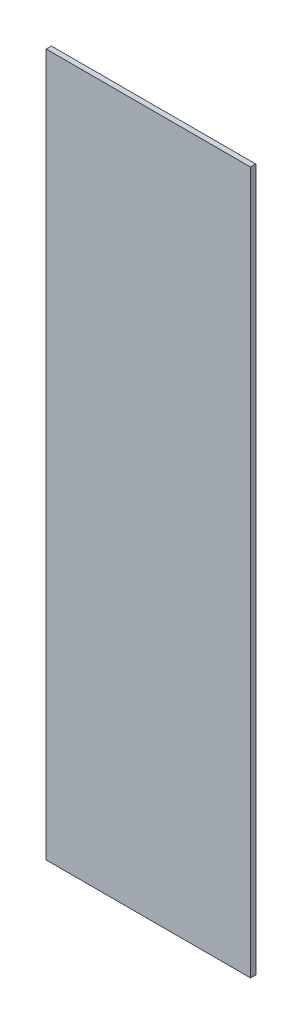
ISO-10303-21;
HEADER;
FILE_DESCRIPTION(('STEP AP214'),'2;1');
FILE_NAME('part.step','',(''),(''),'','','');
FILE_SCHEMA(('AUTOMOTIVE_DESIGN { 1 0 10303 214 1 1 1 1 }'));
ENDSEC;
DATA;
#1=APPLICATION_CONTEXT('core data for automotive mechanical design processes');
#2=APPLICATION_PROTOCOL_DEFINITION('international standard','automotive_design',2000,#1);
#3=PRODUCT_CONTEXT('',#1,'mechanical');
#4=PRODUCT('Part','Part','',(#3));
#5=PRODUCT_RELATED_PRODUCT_CATEGORY('part','',(#4));
#6=PRODUCT_DEFINITION_FORMATION('','',#4);
#7=PRODUCT_DEFINITION_CONTEXT('part definition',#1,'design');
#8=PRODUCT_DEFINITION('design','',#6,#7);
#9=PRODUCT_DEFINITION_SHAPE('','',#8);
#10=(LENGTH_UNIT() NAMED_UNIT(*) SI_UNIT(.MILLI.,.METRE.));
#11=(NAMED_UNIT(*) PLANE_ANGLE_UNIT() SI_UNIT($,.RADIAN.));
#12=(NAMED_UNIT(*) SI_UNIT($,.STERADIAN.) SOLID_ANGLE_UNIT());
#13=UNCERTAINTY_MEASURE_WITH_UNIT(LENGTH_MEASURE(1.E-05),#10,'distance_accuracy_value','');
#14=(GEOMETRIC_REPRESENTATION_CONTEXT(3) GLOBAL_UNCERTAINTY_ASSIGNED_CONTEXT((#13)) GLOBAL_UNIT_ASSIGNED_CONTEXT((#10,
#11,#12)) REPRESENTATION_CONTEXT('',''));
#15=CARTESIAN_POINT('',(0.,0.,0.));
#16=DIRECTION('',(0.,0.,1.));
#17=DIRECTION('',(1.,0.,0.));
#18=AXIS2_PLACEMENT_3D('',#15,#16,#17);
#19=CARTESIAN_POINT('',(97.4999999999999,335.,5.));
#20=DIRECTION('',(-1.,0.,0.));
#21=DIRECTION('',(0.,-1.,0.));
#22=AXIS2_PLACEMENT_3D('',#19,#20,#21);
#23=PLANE('',#22);
#24=DIRECTION('',(0.,1.,0.));
#25=VECTOR('',#24,1.);
#26=CARTESIAN_POINT('',(97.4999999999999,335.,0.));
#27=LINE('',#26,#25);
#28=CARTESIAN_POINT('',(97.5,-335.,0.));
#29=VERTEX_POINT('',#28);
#30=CARTESIAN_POINT('',(97.4999999999999,335.,0.));
#31=VERTEX_POINT('',#30);
#32=EDGE_CURVE('E99',#29,#31,#27,.T.);
#33=ORIENTED_EDGE('',*,*,#32,.T.);
#34=DIRECTION('',(0.,0.,-1.));
#35=VECTOR('',#34,1.);
#36=CARTESIAN_POINT('',(97.4999999999999,335.,5.));
#37=LINE('',#36,#35);
#38=CARTESIAN_POINT('',(97.4999999999999,335.,5.));
#39=VERTEX_POINT('',#38);
#40=EDGE_CURVE('E11',#39,#31,#37,.T.);
#41=ORIENTED_EDGE('',*,*,#40,.F.);
#42=DIRECTION('',(0.,1.,0.));
#43=VECTOR('',#42,1.);
#44=CARTESIAN_POINT('',(97.4999999999999,335.,5.));
#45=LINE('',#44,#43);
#46=CARTESIAN_POINT('',(97.5,-335.,5.));
#47=VERTEX_POINT('',#46);
#48=EDGE_CURVE('E87',#47,#39,#45,.T.);
#49=ORIENTED_EDGE('',*,*,#48,.F.);
#50=DIRECTION('',(0.,0.,-1.));
#51=VECTOR('',#50,1.);
#52=CARTESIAN_POINT('',(97.5,-335.,5.));
#53=LINE('',#52,#51);
#54=EDGE_CURVE('E95',#47,#29,#53,.T.);
#55=ORIENTED_EDGE('',*,*,#54,.T.);
#56=EDGE_LOOP('',(#33,#41,#49,#55));
#57=FACE_BOUND('',#56,.T.);
#58=ADVANCED_FACE('F36',(#57),#23,.F.);
#59=CARTESIAN_POINT('',(-97.5000000000001,335.,5.));
#60=DIRECTION('',(0.,-1.,0.));
#61=DIRECTION('',(0.,0.,-1.));
#62=AXIS2_PLACEMENT_3D('',#59,#60,#61);
#63=PLANE('',#62);
#64=DIRECTION('',(-1.,0.,0.));
#65=VECTOR('',#64,1.);
#66=CARTESIAN_POINT('',(-97.5000000000001,335.,0.));
#67=LINE('',#66,#65);
#68=CARTESIAN_POINT('',(-97.5000000000001,335.,0.));
#69=VERTEX_POINT('',#68);
#70=EDGE_CURVE('E91',#31,#69,#67,.T.);
#71=ORIENTED_EDGE('',*,*,#70,.T.);
#72=DIRECTION('',(0.,0.,-1.));
#73=VECTOR('',#72,1.);
#74=CARTESIAN_POINT('',(-97.5000000000001,335.,5.));
#75=LINE('',#74,#73);
#76=CARTESIAN_POINT('',(-97.5000000000001,335.,5.));
#77=VERTEX_POINT('',#76);
#78=EDGE_CURVE('E44',#77,#69,#75,.T.);
#79=ORIENTED_EDGE('',*,*,#78,.F.);
#80=DIRECTION('',(-1.,0.,0.));
#81=VECTOR('',#80,1.);
#82=CARTESIAN_POINT('',(-97.5000000000001,335.,5.));
#83=LINE('',#82,#81);
#84=EDGE_CURVE('E82',#39,#77,#83,.T.);
#85=ORIENTED_EDGE('',*,*,#84,.F.);
#86=ORIENTED_EDGE('',*,*,#40,.T.);
#87=EDGE_LOOP('',(#71,#79,#85,#86));
#88=FACE_BOUND('',#87,.T.);
#89=ADVANCED_FACE('F90',(#88),#63,.F.);
#90=CARTESIAN_POINT('',(-97.5000000000001,335.,5.));
#91=DIRECTION('',(1.,0.,0.));
#92=DIRECTION('',(0.,1.,0.));
#93=AXIS2_PLACEMENT_3D('',#90,#91,#92);
#94=PLANE('',#93);
#95=DIRECTION('',(0.,-1.,0.));
#96=VECTOR('',#95,1.);
#97=CARTESIAN_POINT('',(-97.5000000000001,335.,0.));
#98=LINE('',#97,#96);
#99=CARTESIAN_POINT('',(-97.5,-335.,0.));
#100=VERTEX_POINT('',#99);
#101=EDGE_CURVE('E69',#69,#100,#98,.T.);
#102=ORIENTED_EDGE('',*,*,#101,.T.);
#103=DIRECTION('',(0.,0.,-1.));
#104=VECTOR('',#103,1.);
#105=CARTESIAN_POINT('',(-97.5,-335.,5.));
#106=LINE('',#105,#104);
#107=CARTESIAN_POINT('',(-97.5,-335.,5.));
#108=VERTEX_POINT('',#107);
#109=EDGE_CURVE('E92',#108,#100,#106,.T.);
#110=ORIENTED_EDGE('',*,*,#109,.F.);
#111=DIRECTION('',(0.,-1.,0.));
#112=VECTOR('',#111,1.);
#113=CARTESIAN_POINT('',(-97.5000000000001,335.,5.));
#114=LINE('',#113,#112);
#115=EDGE_CURVE('E85',#77,#108,#114,.T.);
#116=ORIENTED_EDGE('',*,*,#115,.F.);
#117=ORIENTED_EDGE('',*,*,#78,.T.);
#118=EDGE_LOOP('',(#102,#110,#116,#117));
#119=FACE_BOUND('',#118,.T.);
#120=ADVANCED_FACE('F93',(#119),#94,.F.);
#121=CARTESIAN_POINT('',(-97.5,-335.,5.));
#122=DIRECTION('',(0.,1.,0.));
#123=DIRECTION('',(0.,0.,1.));
#124=AXIS2_PLACEMENT_3D('',#121,#122,#123);
#125=PLANE('',#124);
#126=DIRECTION('',(1.,0.,0.));
#127=VECTOR('',#126,1.);
#128=CARTESIAN_POINT('',(-97.5,-335.,0.));
#129=LINE('',#128,#127);
#130=EDGE_CURVE('E75',#100,#29,#129,.T.);
#131=ORIENTED_EDGE('',*,*,#130,.T.);
#132=ORIENTED_EDGE('',*,*,#54,.F.);
#133=DIRECTION('',(1.,0.,0.));
#134=VECTOR('',#133,1.);
#135=CARTESIAN_POINT('',(-97.5,-335.,5.));
#136=LINE('',#135,#134);
#137=EDGE_CURVE('E52',#108,#47,#136,.T.);
#138=ORIENTED_EDGE('',*,*,#137,.F.);
#139=ORIENTED_EDGE('',*,*,#109,.T.);
#140=EDGE_LOOP('',(#131,#132,#138,#139));
#141=FACE_BOUND('',#140,.T.);
#142=ADVANCED_FACE('F106',(#141),#125,.F.);
#143=CARTESIAN_POINT('',(0.,0.,5.));
#144=DIRECTION('',(0.,0.,1.));
#145=DIRECTION('',(1.,0.,0.));
#146=AXIS2_PLACEMENT_3D('',#143,#144,#145);
#147=PLANE('',#146);
#148=ORIENTED_EDGE('',*,*,#48,.T.);
#149=ORIENTED_EDGE('',*,*,#84,.T.);
#150=ORIENTED_EDGE('',*,*,#115,.T.);
#151=ORIENTED_EDGE('',*,*,#137,.T.);
#152=EDGE_LOOP('',(#148,#149,#150,#151));
#153=FACE_BOUND('',#152,.T.);
#154=ADVANCED_FACE('F83',(#153),#147,.T.);
#155=CARTESIAN_POINT('',(0.,0.,0.));
#156=DIRECTION('',(0.,0.,1.));
#157=DIRECTION('',(1.,0.,0.));
#158=AXIS2_PLACEMENT_3D('',#155,#156,#157);
#159=PLANE('',#158);
#160=ORIENTED_EDGE('',*,*,#32,.F.);
#161=ORIENTED_EDGE('',*,*,#130,.F.);
#162=ORIENTED_EDGE('',*,*,#101,.F.);
#163=ORIENTED_EDGE('',*,*,#70,.F.);
#164=EDGE_LOOP('',(#160,#161,#162,#163));
#165=FACE_BOUND('',#164,.T.);
#166=ADVANCED_FACE('F109',(#165),#159,.F.);
#167=CLOSED_SHELL('',(#58,#89,#120,#142,#154,#166));
#168=MANIFOLD_SOLID_BREP('B2',#167);
#169=ADVANCED_BREP_SHAPE_REPRESENTATION('',(#18,#168),#14);
#170=SHAPE_DEFINITION_REPRESENTATION(#9,#169);
ENDSEC;
END-ISO-10303-21;
